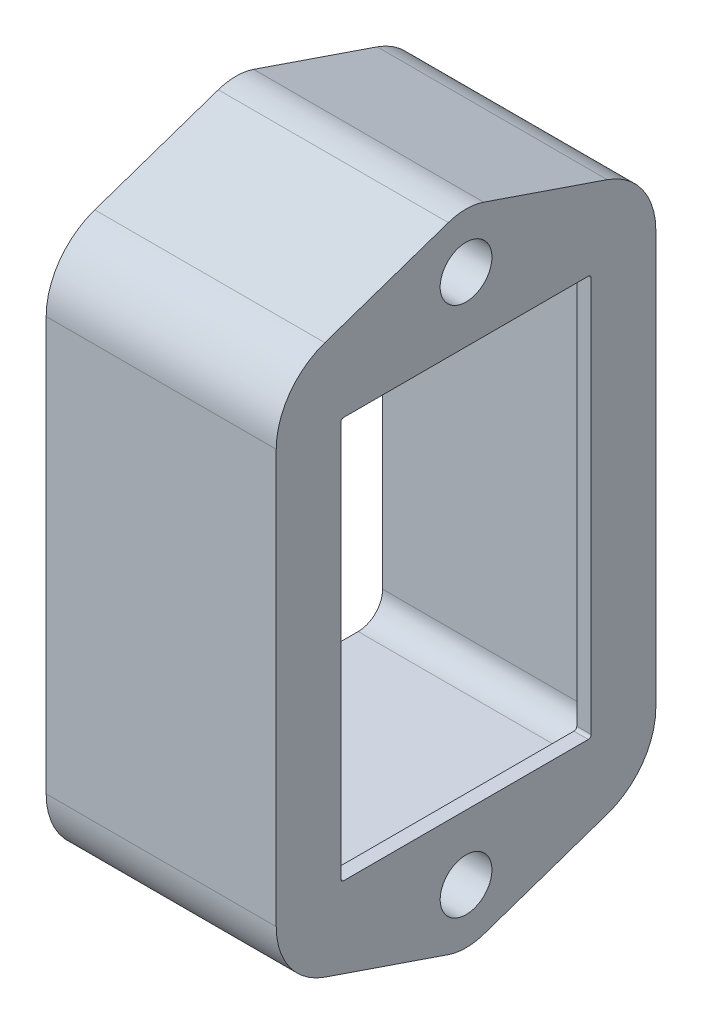
ISO-10303-21;
HEADER;
FILE_DESCRIPTION(('STEP AP214'),'2;1');
FILE_NAME('part.step','',(''),(''),'','','');
FILE_SCHEMA(('AUTOMOTIVE_DESIGN { 1 0 10303 214 1 1 1 1 }'));
ENDSEC;
DATA;
#1=APPLICATION_CONTEXT('core data for automotive mechanical design processes');
#2=APPLICATION_PROTOCOL_DEFINITION('international standard','automotive_design',2000,#1);
#3=PRODUCT_CONTEXT('',#1,'mechanical');
#4=PRODUCT('Part','Part','',(#3));
#5=PRODUCT_RELATED_PRODUCT_CATEGORY('part','',(#4));
#6=PRODUCT_DEFINITION_FORMATION('','',#4);
#7=PRODUCT_DEFINITION_CONTEXT('part definition',#1,'design');
#8=PRODUCT_DEFINITION('design','',#6,#7);
#9=PRODUCT_DEFINITION_SHAPE('','',#8);
#10=(LENGTH_UNIT() NAMED_UNIT(*) SI_UNIT(.MILLI.,.METRE.));
#11=(NAMED_UNIT(*) PLANE_ANGLE_UNIT() SI_UNIT($,.RADIAN.));
#12=(NAMED_UNIT(*) SI_UNIT($,.STERADIAN.) SOLID_ANGLE_UNIT());
#13=UNCERTAINTY_MEASURE_WITH_UNIT(LENGTH_MEASURE(1.E-05),#10,'distance_accuracy_value','');
#14=(GEOMETRIC_REPRESENTATION_CONTEXT(3) GLOBAL_UNCERTAINTY_ASSIGNED_CONTEXT((#13)) GLOBAL_UNIT_ASSIGNED_CONTEXT((#10,
#11,#12)) REPRESENTATION_CONTEXT('',''));
#15=CARTESIAN_POINT('',(0.,0.,0.));
#16=DIRECTION('',(0.,0.,1.));
#17=DIRECTION('',(1.,0.,0.));
#18=AXIS2_PLACEMENT_3D('',#15,#16,#17);
#19=CARTESIAN_POINT('',(2.,-40.2126231948041,-17.0000000000001));
#20=DIRECTION('',(-1.,0.,0.));
#21=DIRECTION('',(0.,0.,1.));
#22=AXIS2_PLACEMENT_3D('',#19,#20,#21);
#23=CYLINDRICAL_SURFACE('',#22,3.4);
#24=DIRECTION('',(-1.,0.,0.));
#25=VECTOR('',#24,1.);
#26=CARTESIAN_POINT('',(2.,-43.6126231948041,-17.0000000000001));
#27=LINE('',#26,#25);
#28=CARTESIAN_POINT('',(0.,-43.6126231948041,-17.0000000000001));
#29=VERTEX_POINT('',#28);
#30=CARTESIAN_POINT('',(-30.,-43.6126231948041,-17.0000000000001));
#31=VERTEX_POINT('',#30);
#32=EDGE_CURVE('E454',#29,#31,#27,.T.);
#33=ORIENTED_EDGE('',*,*,#32,.F.);
#34=CARTESIAN_POINT('',(0.,-40.2126231948041,-17.0000000000001));
#35=DIRECTION('',(1.,0.,0.));
#36=DIRECTION('',(0.,0.,-1.));
#37=AXIS2_PLACEMENT_3D('',#34,#35,#36);
#38=CIRCLE('',#37,3.4);
#39=CARTESIAN_POINT('',(0.,-40.2126231948041,-20.4000000000001));
#40=VERTEX_POINT('',#39);
#41=EDGE_CURVE('E61',#29,#40,#38,.T.);
#42=ORIENTED_EDGE('',*,*,#41,.T.);
#43=DIRECTION('',(-1.,0.,0.));
#44=VECTOR('',#43,1.);
#45=CARTESIAN_POINT('',(2.,-40.2126231948041,-20.4000000000001));
#46=LINE('',#45,#44);
#47=CARTESIAN_POINT('',(-30.,-40.2126231948041,-20.4000000000001));
#48=VERTEX_POINT('',#47);
#49=EDGE_CURVE('E475',#40,#48,#46,.T.);
#50=ORIENTED_EDGE('',*,*,#49,.T.);
#51=CARTESIAN_POINT('',(-30.,-40.2126231948041,-17.0000000000001));
#52=DIRECTION('',(1.,0.,0.));
#53=DIRECTION('',(0.,0.,-1.));
#54=AXIS2_PLACEMENT_3D('',#51,#52,#53);
#55=CIRCLE('',#54,3.4);
#56=EDGE_CURVE('E366',#31,#48,#55,.T.);
#57=ORIENTED_EDGE('',*,*,#56,.F.);
#58=EDGE_LOOP('',(#33,#42,#50,#57));
#59=FACE_BOUND('',#58,.T.);
#60=ADVANCED_FACE('F45',(#59),#23,.F.);
#61=CARTESIAN_POINT('',(2.,-40.2126231948041,-20.4000000000001));
#62=DIRECTION('',(0.,0.,1.));
#63=DIRECTION('',(1.,0.,0.));
#64=AXIS2_PLACEMENT_3D('',#61,#62,#63);
#65=PLANE('',#64);
#66=ORIENTED_EDGE('',*,*,#49,.F.);
#67=DIRECTION('',(0.,1.,0.));
#68=VECTOR('',#67,1.);
#69=CARTESIAN_POINT('',(0.,-40.2126231948041,-20.4000000000001));
#70=LINE('',#69,#68);
#71=CARTESIAN_POINT('',(0.,14.7873768051959,-20.4000000000001));
#72=VERTEX_POINT('',#71);
#73=EDGE_CURVE('E338',#40,#72,#70,.T.);
#74=ORIENTED_EDGE('',*,*,#73,.T.);
#75=DIRECTION('',(-1.,0.,0.));
#76=VECTOR('',#75,1.);
#77=CARTESIAN_POINT('',(2.,14.7873768051959,-20.4000000000001));
#78=LINE('',#77,#76);
#79=CARTESIAN_POINT('',(-30.,14.7873768051959,-20.4000000000001));
#80=VERTEX_POINT('',#79);
#81=EDGE_CURVE('E472',#72,#80,#78,.T.);
#82=ORIENTED_EDGE('',*,*,#81,.T.);
#83=DIRECTION('',(0.,1.,0.));
#84=VECTOR('',#83,1.);
#85=CARTESIAN_POINT('',(-30.,-40.2126231948041,-20.4000000000001));
#86=LINE('',#85,#84);
#87=EDGE_CURVE('E370',#48,#80,#86,.T.);
#88=ORIENTED_EDGE('',*,*,#87,.F.);
#89=EDGE_LOOP('',(#66,#74,#82,#88));
#90=FACE_BOUND('',#89,.T.);
#91=ADVANCED_FACE('F641',(#90),#65,.T.);
#92=CARTESIAN_POINT('',(2.,14.7873768051959,-17.0000000000001));
#93=DIRECTION('',(-1.,0.,0.));
#94=DIRECTION('',(0.,0.,1.));
#95=AXIS2_PLACEMENT_3D('',#92,#93,#94);
#96=CYLINDRICAL_SURFACE('',#95,3.4);
#97=ORIENTED_EDGE('',*,*,#81,.F.);
#98=CARTESIAN_POINT('',(0.,14.7873768051959,-17.0000000000001));
#99=DIRECTION('',(1.,0.,0.));
#100=DIRECTION('',(0.,0.,-1.));
#101=AXIS2_PLACEMENT_3D('',#98,#99,#100);
#102=CIRCLE('',#101,3.40000000000001);
#103=CARTESIAN_POINT('',(0.,18.1873768051959,-17.0000000000001));
#104=VERTEX_POINT('',#103);
#105=EDGE_CURVE('E342',#72,#104,#102,.T.);
#106=ORIENTED_EDGE('',*,*,#105,.T.);
#107=DIRECTION('',(-1.,0.,0.));
#108=VECTOR('',#107,1.);
#109=CARTESIAN_POINT('',(2.,18.1873768051959,-17.0000000000001));
#110=LINE('',#109,#108);
#111=CARTESIAN_POINT('',(-30.,18.1873768051959,-17.0000000000001));
#112=VERTEX_POINT('',#111);
#113=EDGE_CURVE('E469',#104,#112,#110,.T.);
#114=ORIENTED_EDGE('',*,*,#113,.T.);
#115=CARTESIAN_POINT('',(-30.,14.7873768051959,-17.0000000000001));
#116=DIRECTION('',(1.,0.,0.));
#117=DIRECTION('',(0.,0.,-1.));
#118=AXIS2_PLACEMENT_3D('',#115,#116,#117);
#119=CIRCLE('',#118,3.4);
#120=EDGE_CURVE('E374',#80,#112,#119,.T.);
#121=ORIENTED_EDGE('',*,*,#120,.F.);
#122=EDGE_LOOP('',(#97,#106,#114,#121));
#123=FACE_BOUND('',#122,.T.);
#124=ADVANCED_FACE('F648',(#123),#96,.F.);
#125=CARTESIAN_POINT('',(2.,18.1873768051959,0.));
#126=DIRECTION('',(0.,-1.,0.));
#127=DIRECTION('',(0.,0.,-1.));
#128=AXIS2_PLACEMENT_3D('',#125,#126,#127);
#129=PLANE('',#128);
#130=ORIENTED_EDGE('',*,*,#113,.F.);
#131=DIRECTION('',(0.,0.,1.));
#132=VECTOR('',#131,1.);
#133=CARTESIAN_POINT('',(0.,18.1873768051959,-17.0000000000001));
#134=LINE('',#133,#132);
#135=CARTESIAN_POINT('',(0.,18.1873768051959,17.0000000000001));
#136=VERTEX_POINT('',#135);
#137=EDGE_CURVE('E346',#104,#136,#134,.T.);
#138=ORIENTED_EDGE('',*,*,#137,.T.);
#139=DIRECTION('',(-1.,0.,0.));
#140=VECTOR('',#139,1.);
#141=CARTESIAN_POINT('',(2.,18.1873768051959,17.0000000000001));
#142=LINE('',#141,#140);
#143=CARTESIAN_POINT('',(-30.,18.1873768051959,17.0000000000001));
#144=VERTEX_POINT('',#143);
#145=EDGE_CURVE('E466',#136,#144,#142,.T.);
#146=ORIENTED_EDGE('',*,*,#145,.T.);
#147=DIRECTION('',(0.,0.,1.));
#148=VECTOR('',#147,1.);
#149=CARTESIAN_POINT('',(-30.,18.1873768051959,-17.0000000000001));
#150=LINE('',#149,#148);
#151=EDGE_CURVE('E378',#112,#144,#150,.T.);
#152=ORIENTED_EDGE('',*,*,#151,.F.);
#153=EDGE_LOOP('',(#130,#138,#146,#152));
#154=FACE_BOUND('',#153,.T.);
#155=ADVANCED_FACE('F816',(#154),#129,.T.);
#156=CARTESIAN_POINT('',(2.,14.7873768051959,17.0000000000001));
#157=DIRECTION('',(-1.,0.,0.));
#158=DIRECTION('',(0.,0.,1.));
#159=AXIS2_PLACEMENT_3D('',#156,#157,#158);
#160=CYLINDRICAL_SURFACE('',#159,3.4);
#161=ORIENTED_EDGE('',*,*,#145,.F.);
#162=CARTESIAN_POINT('',(0.,14.7873768051959,17.0000000000001));
#163=DIRECTION('',(1.,0.,0.));
#164=DIRECTION('',(0.,0.,-1.));
#165=AXIS2_PLACEMENT_3D('',#162,#163,#164);
#166=CIRCLE('',#165,3.4);
#167=CARTESIAN_POINT('',(0.,14.7873768051959,20.4000000000001));
#168=VERTEX_POINT('',#167);
#169=EDGE_CURVE('E350',#136,#168,#166,.T.);
#170=ORIENTED_EDGE('',*,*,#169,.T.);
#171=DIRECTION('',(-1.,0.,0.));
#172=VECTOR('',#171,1.);
#173=CARTESIAN_POINT('',(2.,14.7873768051959,20.4000000000001));
#174=LINE('',#173,#172);
#175=CARTESIAN_POINT('',(-30.,14.7873768051959,20.4000000000001));
#176=VERTEX_POINT('',#175);
#177=EDGE_CURVE('E463',#168,#176,#174,.T.);
#178=ORIENTED_EDGE('',*,*,#177,.T.);
#179=CARTESIAN_POINT('',(-30.,14.7873768051959,17.0000000000001));
#180=DIRECTION('',(1.,0.,0.));
#181=DIRECTION('',(0.,0.,-1.));
#182=AXIS2_PLACEMENT_3D('',#179,#180,#181);
#183=CIRCLE('',#182,3.4);
#184=EDGE_CURVE('E382',#144,#176,#183,.T.);
#185=ORIENTED_EDGE('',*,*,#184,.F.);
#186=EDGE_LOOP('',(#161,#170,#178,#185));
#187=FACE_BOUND('',#186,.T.);
#188=ADVANCED_FACE('F807',(#187),#160,.F.);
#189=CARTESIAN_POINT('',(2.,14.7873768051959,20.4000000000001));
#190=DIRECTION('',(0.,0.,-1.));
#191=DIRECTION('',(-1.,0.,0.));
#192=AXIS2_PLACEMENT_3D('',#189,#190,#191);
#193=PLANE('',#192);
#194=ORIENTED_EDGE('',*,*,#177,.F.);
#195=DIRECTION('',(0.,-1.,0.));
#196=VECTOR('',#195,1.);
#197=CARTESIAN_POINT('',(0.,14.7873768051959,20.4000000000001));
#198=LINE('',#197,#196);
#199=CARTESIAN_POINT('',(0.,-40.2126231948041,20.4000000000001));
#200=VERTEX_POINT('',#199);
#201=EDGE_CURVE('E354',#168,#200,#198,.T.);
#202=ORIENTED_EDGE('',*,*,#201,.T.);
#203=DIRECTION('',(-1.,0.,0.));
#204=VECTOR('',#203,1.);
#205=CARTESIAN_POINT('',(2.,-40.2126231948041,20.4000000000001));
#206=LINE('',#205,#204);
#207=CARTESIAN_POINT('',(-30.,-40.2126231948041,20.4000000000001));
#208=VERTEX_POINT('',#207);
#209=EDGE_CURVE('E460',#200,#208,#206,.T.);
#210=ORIENTED_EDGE('',*,*,#209,.T.);
#211=DIRECTION('',(0.,-1.,0.));
#212=VECTOR('',#211,1.);
#213=CARTESIAN_POINT('',(-30.,14.7873768051959,20.4000000000001));
#214=LINE('',#213,#212);
#215=EDGE_CURVE('E386',#176,#208,#214,.T.);
#216=ORIENTED_EDGE('',*,*,#215,.F.);
#217=EDGE_LOOP('',(#194,#202,#210,#216));
#218=FACE_BOUND('',#217,.T.);
#219=ADVANCED_FACE('F798',(#218),#193,.T.);
#220=CARTESIAN_POINT('',(2.,-40.2126231948041,17.0000000000001));
#221=DIRECTION('',(-1.,0.,0.));
#222=DIRECTION('',(0.,0.,1.));
#223=AXIS2_PLACEMENT_3D('',#220,#221,#222);
#224=CYLINDRICAL_SURFACE('',#223,3.4);
#225=ORIENTED_EDGE('',*,*,#209,.F.);
#226=CARTESIAN_POINT('',(0.,-40.2126231948041,17.0000000000001));
#227=DIRECTION('',(1.,0.,0.));
#228=DIRECTION('',(0.,0.,-1.));
#229=AXIS2_PLACEMENT_3D('',#226,#227,#228);
#230=CIRCLE('',#229,3.4);
#231=CARTESIAN_POINT('',(0.,-43.6126231948041,17.0000000000001));
#232=VERTEX_POINT('',#231);
#233=EDGE_CURVE('E312',#200,#232,#230,.T.);
#234=ORIENTED_EDGE('',*,*,#233,.T.);
#235=DIRECTION('',(-1.,0.,0.));
#236=VECTOR('',#235,1.);
#237=CARTESIAN_POINT('',(2.,-43.6126231948041,17.0000000000001));
#238=LINE('',#237,#236);
#239=CARTESIAN_POINT('',(-30.,-43.6126231948041,17.0000000000001));
#240=VERTEX_POINT('',#239);
#241=EDGE_CURVE('E457',#232,#240,#238,.T.);
#242=ORIENTED_EDGE('',*,*,#241,.T.);
#243=CARTESIAN_POINT('',(-30.,-40.2126231948041,17.0000000000001));
#244=DIRECTION('',(1.,0.,0.));
#245=DIRECTION('',(0.,0.,-1.));
#246=AXIS2_PLACEMENT_3D('',#243,#244,#245);
#247=CIRCLE('',#246,3.4);
#248=EDGE_CURVE('E390',#208,#240,#247,.T.);
#249=ORIENTED_EDGE('',*,*,#248,.F.);
#250=EDGE_LOOP('',(#225,#234,#242,#249));
#251=FACE_BOUND('',#250,.T.);
#252=ADVANCED_FACE('F786',(#251),#224,.F.);
#253=CARTESIAN_POINT('',(2.,-43.6126231948041,0.));
#254=DIRECTION('',(0.,1.,0.));
#255=DIRECTION('',(0.,0.,1.));
#256=AXIS2_PLACEMENT_3D('',#253,#254,#255);
#257=PLANE('',#256);
#258=ORIENTED_EDGE('',*,*,#241,.F.);
#259=DIRECTION('',(0.,0.,-1.));
#260=VECTOR('',#259,1.);
#261=CARTESIAN_POINT('',(0.,-43.6126231948041,17.0000000000001));
#262=LINE('',#261,#260);
#263=EDGE_CURVE('E333',#232,#29,#262,.T.);
#264=ORIENTED_EDGE('',*,*,#263,.T.);
#265=ORIENTED_EDGE('',*,*,#32,.T.);
#266=DIRECTION('',(0.,0.,-1.));
#267=VECTOR('',#266,1.);
#268=CARTESIAN_POINT('',(-30.,-43.6126231948041,17.0000000000001));
#269=LINE('',#268,#267);
#270=EDGE_CURVE('E394',#240,#31,#269,.T.);
#271=ORIENTED_EDGE('',*,*,#270,.F.);
#272=EDGE_LOOP('',(#258,#264,#265,#271));
#273=FACE_BOUND('',#272,.T.);
#274=ADVANCED_FACE('F604',(#273),#257,.T.);
#275=CARTESIAN_POINT('',(2.,16.0396786229446,-16.4000000000001));
#276=DIRECTION('',(-1.,0.,0.));
#277=DIRECTION('',(0.,0.,1.));
#278=AXIS2_PLACEMENT_3D('',#275,#276,#277);
#279=PLANE('',#278);
#280=CARTESIAN_POINT('',(2.,16.0396786229446,-16.4000000000001));
#281=DIRECTION('',(1.,0.,0.));
#282=DIRECTION('',(0.,0.,1.));
#283=AXIS2_PLACEMENT_3D('',#280,#281,#282);
#284=CIRCLE('',#283,10.);
#285=CARTESIAN_POINT('',(2.,16.0396786229446,-26.4000000000001));
#286=VERTEX_POINT('',#285);
#287=CARTESIAN_POINT('',(2.,25.501214940769,-19.6371794059783));
#288=VERTEX_POINT('',#287);
#289=EDGE_CURVE('E478',#286,#288,#284,.T.);
#290=ORIENTED_EDGE('',*,*,#289,.T.);
#291=DIRECTION('',(0.,0.323717940597819,0.946153631782443));
#292=VECTOR('',#291,1.);
#293=CARTESIAN_POINT('',(2.,25.501214940769,-19.6371794059783));
#294=LINE('',#293,#292);
#295=CARTESIAN_POINT('',(2.,31.3781444067425,-2.46025634854342));
#296=VERTEX_POINT('',#295);
#297=EDGE_CURVE('E481',#288,#296,#294,.T.);
#298=ORIENTED_EDGE('',*,*,#297,.T.);
#299=CARTESIAN_POINT('',(2.,24.1873768051959,0.));
#300=DIRECTION('',(1.,0.,0.));
#301=DIRECTION('',(0.,0.,-1.));
#302=AXIS2_PLACEMENT_3D('',#299,#300,#301);
#303=CIRCLE('',#302,7.6);
#304=CARTESIAN_POINT('',(2.,31.3781444067425,2.46025634854342));
#305=VERTEX_POINT('',#304);
#306=EDGE_CURVE('E484',#296,#305,#303,.T.);
#307=ORIENTED_EDGE('',*,*,#306,.T.);
#308=DIRECTION('',(0.,-0.323717940597819,0.946153631782443));
#309=VECTOR('',#308,1.);
#310=CARTESIAN_POINT('',(2.,25.501214940769,19.6371794059783));
#311=LINE('',#310,#309);
#312=CARTESIAN_POINT('',(2.,25.501214940769,19.6371794059783));
#313=VERTEX_POINT('',#312);
#314=EDGE_CURVE('E487',#305,#313,#311,.T.);
#315=ORIENTED_EDGE('',*,*,#314,.T.);
#316=CARTESIAN_POINT('',(2.,16.0396786229446,16.4000000000001));
#317=DIRECTION('',(1.,0.,0.));
#318=DIRECTION('',(0.,0.,-1.));
#319=AXIS2_PLACEMENT_3D('',#316,#317,#318);
#320=CIRCLE('',#319,10.);
#321=CARTESIAN_POINT('',(2.,16.0396786229446,26.4000000000001));
#322=VERTEX_POINT('',#321);
#323=EDGE_CURVE('E490',#313,#322,#320,.T.);
#324=ORIENTED_EDGE('',*,*,#323,.T.);
#325=DIRECTION('',(0.,-1.,0.));
#326=VECTOR('',#325,1.);
#327=CARTESIAN_POINT('',(2.,-41.4649250125528,26.4000000000001));
#328=LINE('',#327,#326);
#329=CARTESIAN_POINT('',(2.,-41.4649250125528,26.4000000000001));
#330=VERTEX_POINT('',#329);
#331=EDGE_CURVE('E493',#322,#330,#328,.T.);
#332=ORIENTED_EDGE('',*,*,#331,.T.);
#333=CARTESIAN_POINT('',(2.,-41.4649250125528,16.4000000000001));
#334=DIRECTION('',(1.,0.,0.));
#335=DIRECTION('',(0.,0.,1.));
#336=AXIS2_PLACEMENT_3D('',#333,#334,#335);
#337=CIRCLE('',#336,9.99999999999999);
#338=CARTESIAN_POINT('',(2.,-50.9264613303773,19.6371794059783));
#339=VERTEX_POINT('',#338);
#340=EDGE_CURVE('E496',#330,#339,#337,.T.);
#341=ORIENTED_EDGE('',*,*,#340,.T.);
#342=DIRECTION('',(0.,-0.323717940597819,-0.946153631782443));
#343=VECTOR('',#342,1.);
#344=CARTESIAN_POINT('',(2.,-50.9264613303773,19.6371794059783));
#345=LINE('',#344,#343);
#346=CARTESIAN_POINT('',(2.,-56.8033907963507,2.46025634854342));
#347=VERTEX_POINT('',#346);
#348=EDGE_CURVE('E499',#339,#347,#345,.T.);
#349=ORIENTED_EDGE('',*,*,#348,.T.);
#350=CARTESIAN_POINT('',(2.,-49.6126231948041,0.));
#351=DIRECTION('',(1.,0.,0.));
#352=DIRECTION('',(0.,0.,1.));
#353=AXIS2_PLACEMENT_3D('',#350,#351,#352);
#354=CIRCLE('',#353,7.60000000000003);
#355=CARTESIAN_POINT('',(2.,-56.8033907963507,-2.46025634854342));
#356=VERTEX_POINT('',#355);
#357=EDGE_CURVE('E502',#347,#356,#354,.T.);
#358=ORIENTED_EDGE('',*,*,#357,.T.);
#359=DIRECTION('',(0.,0.323717940597819,-0.946153631782443));
#360=VECTOR('',#359,1.);
#361=CARTESIAN_POINT('',(2.,-50.9264613303773,-19.6371794059783));
#362=LINE('',#361,#360);
#363=CARTESIAN_POINT('',(2.,-50.9264613303773,-19.6371794059783));
#364=VERTEX_POINT('',#363);
#365=EDGE_CURVE('E505',#356,#364,#362,.T.);
#366=ORIENTED_EDGE('',*,*,#365,.T.);
#367=CARTESIAN_POINT('',(2.,-41.4649250125528,-16.4000000000001));
#368=DIRECTION('',(1.,0.,0.));
#369=DIRECTION('',(0.,0.,-1.));
#370=AXIS2_PLACEMENT_3D('',#367,#368,#369);
#371=CIRCLE('',#370,9.99999999999999);
#372=CARTESIAN_POINT('',(2.,-41.4649250125528,-26.4000000000001));
#373=VERTEX_POINT('',#372);
#374=EDGE_CURVE('E508',#364,#373,#371,.T.);
#375=ORIENTED_EDGE('',*,*,#374,.T.);
#376=DIRECTION('',(0.,1.,0.));
#377=VECTOR('',#376,1.);
#378=CARTESIAN_POINT('',(2.,-41.4649250125528,-26.4000000000001));
#379=LINE('',#378,#377);
#380=EDGE_CURVE('E69',#373,#286,#379,.T.);
#381=ORIENTED_EDGE('',*,*,#380,.T.);
#382=EDGE_LOOP('',(#290,#298,#307,#315,#324,#332,#341,#349,#358,#366,#375,#381));
#383=FACE_BOUND('',#382,.T.);
#384=CARTESIAN_POINT('',(2.,24.1873768051959,0.));
#385=DIRECTION('',(1.,0.,0.));
#386=DIRECTION('',(0.,0.,-1.));
#387=AXIS2_PLACEMENT_3D('',#384,#385,#386);
#388=CIRCLE('',#387,3.6);
#389=CARTESIAN_POINT('',(2.,24.1873768051959,-3.6));
#390=VERTEX_POINT('',#389);
#391=EDGE_CURVE('E450',#390,#390,#388,.T.);
#392=ORIENTED_EDGE('',*,*,#391,.F.);
#393=EDGE_LOOP('',(#392));
#394=FACE_BOUND('',#393,.T.);
#395=CARTESIAN_POINT('',(2.,-49.6126231948041,0.));
#396=DIRECTION('',(1.,0.,0.));
#397=DIRECTION('',(0.,0.,1.));
#398=AXIS2_PLACEMENT_3D('',#395,#396,#397);
#399=CIRCLE('',#398,3.6);
#400=CARTESIAN_POINT('',(2.,-49.6126231948041,3.6));
#401=VERTEX_POINT('',#400);
#402=EDGE_CURVE('E446',#401,#401,#399,.T.);
#403=ORIENTED_EDGE('',*,*,#402,.F.);
#404=EDGE_LOOP('',(#403));
#405=FACE_BOUND('',#404,.T.);
#406=CARTESIAN_POINT('',(2.,-40.2126231948041,17.0000000000001));
#407=DIRECTION('',(1.,0.,0.));
#408=DIRECTION('',(0.,0.,-1.));
#409=AXIS2_PLACEMENT_3D('',#406,#407,#408);
#410=CIRCLE('',#409,0.400000000000003);
#411=CARTESIAN_POINT('',(2.,-40.2126231948041,17.4000000000001));
#412=VERTEX_POINT('',#411);
#413=CARTESIAN_POINT('',(2.,-40.6126231948041,17.0000000000001));
#414=VERTEX_POINT('',#413);
#415=EDGE_CURVE('E238',#412,#414,#410,.T.);
#416=ORIENTED_EDGE('',*,*,#415,.F.);
#417=DIRECTION('',(0.,-1.,0.));
#418=VECTOR('',#417,1.);
#419=CARTESIAN_POINT('',(2.,14.7873768051959,17.4000000000001));
#420=LINE('',#419,#418);
#421=CARTESIAN_POINT('',(2.,14.7873768051959,17.4000000000001));
#422=VERTEX_POINT('',#421);
#423=EDGE_CURVE('E259',#422,#412,#420,.T.);
#424=ORIENTED_EDGE('',*,*,#423,.F.);
#425=CARTESIAN_POINT('',(2.,14.7873768051959,17.0000000000001));
#426=DIRECTION('',(1.,0.,0.));
#427=DIRECTION('',(0.,0.,-1.));
#428=AXIS2_PLACEMENT_3D('',#425,#426,#427);
#429=CIRCLE('',#428,0.400000000000005);
#430=CARTESIAN_POINT('',(2.,15.1873768051959,17.0000000000001));
#431=VERTEX_POINT('',#430);
#432=EDGE_CURVE('E263',#431,#422,#429,.T.);
#433=ORIENTED_EDGE('',*,*,#432,.F.);
#434=DIRECTION('',(0.,0.,1.));
#435=VECTOR('',#434,1.);
#436=CARTESIAN_POINT('',(2.,15.1873768051959,-17.0000000000001));
#437=LINE('',#436,#435);
#438=CARTESIAN_POINT('',(2.,15.1873768051959,-17.0000000000001));
#439=VERTEX_POINT('',#438);
#440=EDGE_CURVE('E302',#439,#431,#437,.T.);
#441=ORIENTED_EDGE('',*,*,#440,.F.);
#442=CARTESIAN_POINT('',(2.,14.7873768051959,-17.0000000000001));
#443=DIRECTION('',(1.,0.,0.));
#444=DIRECTION('',(0.,0.,-1.));
#445=AXIS2_PLACEMENT_3D('',#442,#443,#444);
#446=CIRCLE('',#445,0.400000000000006);
#447=CARTESIAN_POINT('',(2.,14.7873768051959,-17.4000000000001));
#448=VERTEX_POINT('',#447);
#449=EDGE_CURVE('E298',#448,#439,#446,.T.);
#450=ORIENTED_EDGE('',*,*,#449,.F.);
#451=DIRECTION('',(0.,1.,0.));
#452=VECTOR('',#451,1.);
#453=CARTESIAN_POINT('',(2.,-40.2126231948041,-17.4000000000001));
#454=LINE('',#453,#452);
#455=CARTESIAN_POINT('',(2.,-40.2126231948041,-17.4000000000001));
#456=VERTEX_POINT('',#455);
#457=EDGE_CURVE('E294',#456,#448,#454,.T.);
#458=ORIENTED_EDGE('',*,*,#457,.F.);
#459=CARTESIAN_POINT('',(2.,-40.2126231948041,-17.0000000000001));
#460=DIRECTION('',(1.,0.,0.));
#461=DIRECTION('',(0.,0.,-1.));
#462=AXIS2_PLACEMENT_3D('',#459,#460,#461);
#463=CIRCLE('',#462,0.400000000000005);
#464=CARTESIAN_POINT('',(2.,-40.6126231948041,-17.0000000000001));
#465=VERTEX_POINT('',#464);
#466=EDGE_CURVE('E290',#465,#456,#463,.T.);
#467=ORIENTED_EDGE('',*,*,#466,.F.);
#468=DIRECTION('',(0.,0.,-1.));
#469=VECTOR('',#468,1.);
#470=CARTESIAN_POINT('',(2.,-40.6126231948041,17.0000000000001));
#471=LINE('',#470,#469);
#472=EDGE_CURVE('E287',#414,#465,#471,.T.);
#473=ORIENTED_EDGE('',*,*,#472,.F.);
#474=EDGE_LOOP('',(#416,#424,#433,#441,#450,#458,#467,#473));
#475=FACE_BOUND('',#474,.T.);
#476=ADVANCED_FACE('F601',(#383,#394,#405,#475),#279,.F.);
#477=CARTESIAN_POINT('',(2.,16.0396786229446,-16.4000000000001));
#478=DIRECTION('',(-1.,0.,0.));
#479=DIRECTION('',(0.,0.,1.));
#480=AXIS2_PLACEMENT_3D('',#477,#478,#479);
#481=CYLINDRICAL_SURFACE('',#480,10.);
#482=DIRECTION('',(-1.,0.,0.));
#483=VECTOR('',#482,1.);
#484=CARTESIAN_POINT('',(2.,16.0396786229446,-26.4000000000001));
#485=LINE('',#484,#483);
#486=CARTESIAN_POINT('',(-30.,16.0396786229446,-26.4000000000001));
#487=VERTEX_POINT('',#486);
#488=EDGE_CURVE('E513',#286,#487,#485,.T.);
#489=ORIENTED_EDGE('',*,*,#488,.T.);
#490=CARTESIAN_POINT('',(-30.,16.0396786229446,-16.4000000000001));
#491=DIRECTION('',(1.,0.,0.));
#492=DIRECTION('',(0.,0.,1.));
#493=AXIS2_PLACEMENT_3D('',#490,#491,#492);
#494=CIRCLE('',#493,10.);
#495=CARTESIAN_POINT('',(-30.,25.501214940769,-19.6371794059783));
#496=VERTEX_POINT('',#495);
#497=EDGE_CURVE('E398',#487,#496,#494,.T.);
#498=ORIENTED_EDGE('',*,*,#497,.T.);
#499=DIRECTION('',(-1.,0.,0.));
#500=VECTOR('',#499,1.);
#501=CARTESIAN_POINT('',(2.,25.501214940769,-19.6371794059783));
#502=LINE('',#501,#500);
#503=EDGE_CURVE('E11',#288,#496,#502,.T.);
#504=ORIENTED_EDGE('',*,*,#503,.F.);
#505=ORIENTED_EDGE('',*,*,#289,.F.);
#506=EDGE_LOOP('',(#489,#498,#504,#505));
#507=FACE_BOUND('',#506,.T.);
#508=ADVANCED_FACE('F47',(#507),#481,.T.);
#509=CARTESIAN_POINT('',(2.,25.501214940769,-19.6371794059783));
#510=DIRECTION('',(0.,-0.946153631782443,0.323717940597819));
#511=DIRECTION('',(0.,-0.323717940597819,-0.946153631782443));
#512=AXIS2_PLACEMENT_3D('',#509,#510,#511);
#513=PLANE('',#512);
#514=ORIENTED_EDGE('',*,*,#503,.T.);
#515=DIRECTION('',(0.,0.323717940597819,0.946153631782443));
#516=VECTOR('',#515,1.);
#517=CARTESIAN_POINT('',(-30.,25.501214940769,-19.6371794059783));
#518=LINE('',#517,#516);
#519=CARTESIAN_POINT('',(-30.,31.3781444067425,-2.46025634854342));
#520=VERTEX_POINT('',#519);
#521=EDGE_CURVE('E402',#496,#520,#518,.T.);
#522=ORIENTED_EDGE('',*,*,#521,.T.);
#523=DIRECTION('',(-1.,0.,0.));
#524=VECTOR('',#523,1.);
#525=CARTESIAN_POINT('',(2.,31.3781444067425,-2.46025634854342));
#526=LINE('',#525,#524);
#527=EDGE_CURVE('E54',#296,#520,#526,.T.);
#528=ORIENTED_EDGE('',*,*,#527,.F.);
#529=ORIENTED_EDGE('',*,*,#297,.F.);
#530=EDGE_LOOP('',(#514,#522,#528,#529));
#531=FACE_BOUND('',#530,.T.);
#532=ADVANCED_FACE('F556',(#531),#513,.F.);
#533=CARTESIAN_POINT('',(2.,24.1873768051959,0.));
#534=DIRECTION('',(-1.,0.,0.));
#535=DIRECTION('',(0.,0.,1.));
#536=AXIS2_PLACEMENT_3D('',#533,#534,#535);
#537=CYLINDRICAL_SURFACE('',#536,7.6);
#538=ORIENTED_EDGE('',*,*,#527,.T.);
#539=CARTESIAN_POINT('',(-30.,24.1873768051959,0.));
#540=DIRECTION('',(1.,0.,0.));
#541=DIRECTION('',(0.,0.,-1.));
#542=AXIS2_PLACEMENT_3D('',#539,#540,#541);
#543=CIRCLE('',#542,7.6);
#544=CARTESIAN_POINT('',(-30.,31.3781444067425,2.46025634854342));
#545=VERTEX_POINT('',#544);
#546=EDGE_CURVE('E406',#520,#545,#543,.T.);
#547=ORIENTED_EDGE('',*,*,#546,.T.);
#548=DIRECTION('',(-1.,0.,0.));
#549=VECTOR('',#548,1.);
#550=CARTESIAN_POINT('',(2.,31.3781444067425,2.46025634854342));
#551=LINE('',#550,#549);
#552=EDGE_CURVE('E540',#305,#545,#551,.T.);
#553=ORIENTED_EDGE('',*,*,#552,.F.);
#554=ORIENTED_EDGE('',*,*,#306,.F.);
#555=EDGE_LOOP('',(#538,#547,#553,#554));
#556=FACE_BOUND('',#555,.T.);
#557=ADVANCED_FACE('F547',(#556),#537,.T.);
#558=CARTESIAN_POINT('',(2.,25.501214940769,19.6371794059783));
#559=DIRECTION('',(0.,-0.946153631782443,-0.323717940597819));
#560=DIRECTION('',(0.,0.323717940597819,-0.946153631782443));
#561=AXIS2_PLACEMENT_3D('',#558,#559,#560);
#562=PLANE('',#561);
#563=ORIENTED_EDGE('',*,*,#552,.T.);
#564=DIRECTION('',(0.,-0.323717940597819,0.946153631782443));
#565=VECTOR('',#564,1.);
#566=CARTESIAN_POINT('',(-30.,25.501214940769,19.6371794059783));
#567=LINE('',#566,#565);
#568=CARTESIAN_POINT('',(-30.,25.501214940769,19.6371794059783));
#569=VERTEX_POINT('',#568);
#570=EDGE_CURVE('E410',#545,#569,#567,.T.);
#571=ORIENTED_EDGE('',*,*,#570,.T.);
#572=DIRECTION('',(-1.,0.,0.));
#573=VECTOR('',#572,1.);
#574=CARTESIAN_POINT('',(2.,25.501214940769,19.6371794059783));
#575=LINE('',#574,#573);
#576=EDGE_CURVE('E537',#313,#569,#575,.T.);
#577=ORIENTED_EDGE('',*,*,#576,.F.);
#578=ORIENTED_EDGE('',*,*,#314,.F.);
#579=EDGE_LOOP('',(#563,#571,#577,#578));
#580=FACE_BOUND('',#579,.T.);
#581=ADVANCED_FACE('F599',(#580),#562,.F.);
#582=CARTESIAN_POINT('',(2.,16.0396786229446,16.4000000000001));
#583=DIRECTION('',(-1.,0.,0.));
#584=DIRECTION('',(0.,0.,1.));
#585=AXIS2_PLACEMENT_3D('',#582,#583,#584);
#586=CYLINDRICAL_SURFACE('',#585,10.);
#587=ORIENTED_EDGE('',*,*,#576,.T.);
#588=CARTESIAN_POINT('',(-30.,16.0396786229446,16.4000000000001));
#589=DIRECTION('',(1.,0.,0.));
#590=DIRECTION('',(0.,0.,-1.));
#591=AXIS2_PLACEMENT_3D('',#588,#589,#590);
#592=CIRCLE('',#591,10.);
#593=CARTESIAN_POINT('',(-30.,16.0396786229446,26.4000000000001));
#594=VERTEX_POINT('',#593);
#595=EDGE_CURVE('E414',#569,#594,#592,.T.);
#596=ORIENTED_EDGE('',*,*,#595,.T.);
#597=DIRECTION('',(-1.,0.,0.));
#598=VECTOR('',#597,1.);
#599=CARTESIAN_POINT('',(2.,16.0396786229446,26.4000000000001));
#600=LINE('',#599,#598);
#601=EDGE_CURVE('E534',#322,#594,#600,.T.);
#602=ORIENTED_EDGE('',*,*,#601,.F.);
#603=ORIENTED_EDGE('',*,*,#323,.F.);
#604=EDGE_LOOP('',(#587,#596,#602,#603));
#605=FACE_BOUND('',#604,.T.);
#606=ADVANCED_FACE('F596',(#605),#586,.T.);
#607=CARTESIAN_POINT('',(2.,-41.4649250125528,26.4000000000001));
#608=DIRECTION('',(0.,0.,-1.));
#609=DIRECTION('',(-1.,0.,0.));
#610=AXIS2_PLACEMENT_3D('',#607,#608,#609);
#611=PLANE('',#610);
#612=ORIENTED_EDGE('',*,*,#601,.T.);
#613=DIRECTION('',(0.,-1.,0.));
#614=VECTOR('',#613,1.);
#615=CARTESIAN_POINT('',(-30.,-41.4649250125528,26.4000000000001));
#616=LINE('',#615,#614);
#617=CARTESIAN_POINT('',(-30.,-41.4649250125528,26.4000000000001));
#618=VERTEX_POINT('',#617);
#619=EDGE_CURVE('E418',#594,#618,#616,.T.);
#620=ORIENTED_EDGE('',*,*,#619,.T.);
#621=DIRECTION('',(-1.,0.,0.));
#622=VECTOR('',#621,1.);
#623=CARTESIAN_POINT('',(2.,-41.4649250125528,26.4000000000001));
#624=LINE('',#623,#622);
#625=EDGE_CURVE('E531',#330,#618,#624,.T.);
#626=ORIENTED_EDGE('',*,*,#625,.F.);
#627=ORIENTED_EDGE('',*,*,#331,.F.);
#628=EDGE_LOOP('',(#612,#620,#626,#627));
#629=FACE_BOUND('',#628,.T.);
#630=ADVANCED_FACE('F591',(#629),#611,.F.);
#631=CARTESIAN_POINT('',(2.,-41.4649250125528,16.4000000000001));
#632=DIRECTION('',(-1.,0.,0.));
#633=DIRECTION('',(0.,0.,1.));
#634=AXIS2_PLACEMENT_3D('',#631,#632,#633);
#635=CYLINDRICAL_SURFACE('',#634,9.99999999999999);
#636=ORIENTED_EDGE('',*,*,#625,.T.);
#637=CARTESIAN_POINT('',(-30.,-41.4649250125528,16.4000000000001));
#638=DIRECTION('',(1.,0.,0.));
#639=DIRECTION('',(0.,0.,1.));
#640=AXIS2_PLACEMENT_3D('',#637,#638,#639);
#641=CIRCLE('',#640,9.99999999999999);
#642=CARTESIAN_POINT('',(-30.,-50.9264613303773,19.6371794059783));
#643=VERTEX_POINT('',#642);
#644=EDGE_CURVE('E422',#618,#643,#641,.T.);
#645=ORIENTED_EDGE('',*,*,#644,.T.);
#646=DIRECTION('',(-1.,0.,0.));
#647=VECTOR('',#646,1.);
#648=CARTESIAN_POINT('',(2.,-50.9264613303773,19.6371794059783));
#649=LINE('',#648,#647);
#650=EDGE_CURVE('E528',#339,#643,#649,.T.);
#651=ORIENTED_EDGE('',*,*,#650,.F.);
#652=ORIENTED_EDGE('',*,*,#340,.F.);
#653=EDGE_LOOP('',(#636,#645,#651,#652));
#654=FACE_BOUND('',#653,.T.);
#655=ADVANCED_FACE('F587',(#654),#635,.T.);
#656=CARTESIAN_POINT('',(2.,-50.9264613303773,19.6371794059783));
#657=DIRECTION('',(0.,0.946153631782443,-0.323717940597819));
#658=DIRECTION('',(0.,0.323717940597819,0.946153631782443));
#659=AXIS2_PLACEMENT_3D('',#656,#657,#658);
#660=PLANE('',#659);
#661=ORIENTED_EDGE('',*,*,#650,.T.);
#662=DIRECTION('',(0.,-0.323717940597819,-0.946153631782443));
#663=VECTOR('',#662,1.);
#664=CARTESIAN_POINT('',(-30.,-50.9264613303773,19.6371794059783));
#665=LINE('',#664,#663);
#666=CARTESIAN_POINT('',(-30.,-56.8033907963507,2.46025634854342));
#667=VERTEX_POINT('',#666);
#668=EDGE_CURVE('E426',#643,#667,#665,.T.);
#669=ORIENTED_EDGE('',*,*,#668,.T.);
#670=DIRECTION('',(-1.,0.,0.));
#671=VECTOR('',#670,1.);
#672=CARTESIAN_POINT('',(2.,-56.8033907963507,2.46025634854342));
#673=LINE('',#672,#671);
#674=EDGE_CURVE('E525',#347,#667,#673,.T.);
#675=ORIENTED_EDGE('',*,*,#674,.F.);
#676=ORIENTED_EDGE('',*,*,#348,.F.);
#677=EDGE_LOOP('',(#661,#669,#675,#676));
#678=FACE_BOUND('',#677,.T.);
#679=ADVANCED_FACE('F582',(#678),#660,.F.);
#680=CARTESIAN_POINT('',(2.,-49.6126231948041,0.));
#681=DIRECTION('',(-1.,0.,0.));
#682=DIRECTION('',(0.,0.,1.));
#683=AXIS2_PLACEMENT_3D('',#680,#681,#682);
#684=CYLINDRICAL_SURFACE('',#683,7.60000000000003);
#685=ORIENTED_EDGE('',*,*,#674,.T.);
#686=CARTESIAN_POINT('',(-30.,-49.6126231948041,0.));
#687=DIRECTION('',(1.,0.,0.));
#688=DIRECTION('',(0.,0.,1.));
#689=AXIS2_PLACEMENT_3D('',#686,#687,#688);
#690=CIRCLE('',#689,7.60000000000003);
#691=CARTESIAN_POINT('',(-30.,-56.8033907963507,-2.46025634854342));
#692=VERTEX_POINT('',#691);
#693=EDGE_CURVE('E430',#667,#692,#690,.T.);
#694=ORIENTED_EDGE('',*,*,#693,.T.);
#695=DIRECTION('',(-1.,0.,0.));
#696=VECTOR('',#695,1.);
#697=CARTESIAN_POINT('',(2.,-56.8033907963507,-2.46025634854342));
#698=LINE('',#697,#696);
#699=EDGE_CURVE('E522',#356,#692,#698,.T.);
#700=ORIENTED_EDGE('',*,*,#699,.F.);
#701=ORIENTED_EDGE('',*,*,#357,.F.);
#702=EDGE_LOOP('',(#685,#694,#700,#701));
#703=FACE_BOUND('',#702,.T.);
#704=ADVANCED_FACE('F577',(#703),#684,.T.);
#705=CARTESIAN_POINT('',(2.,-50.9264613303773,-19.6371794059783));
#706=DIRECTION('',(0.,0.946153631782443,0.323717940597819));
#707=DIRECTION('',(0.,-0.323717940597819,0.946153631782443));
#708=AXIS2_PLACEMENT_3D('',#705,#706,#707);
#709=PLANE('',#708);
#710=ORIENTED_EDGE('',*,*,#699,.T.);
#711=DIRECTION('',(0.,0.323717940597819,-0.946153631782443));
#712=VECTOR('',#711,1.);
#713=CARTESIAN_POINT('',(-30.,-50.9264613303773,-19.6371794059783));
#714=LINE('',#713,#712);
#715=CARTESIAN_POINT('',(-30.,-50.9264613303773,-19.6371794059783));
#716=VERTEX_POINT('',#715);
#717=EDGE_CURVE('E434',#692,#716,#714,.T.);
#718=ORIENTED_EDGE('',*,*,#717,.T.);
#719=DIRECTION('',(-1.,0.,0.));
#720=VECTOR('',#719,1.);
#721=CARTESIAN_POINT('',(2.,-50.9264613303773,-19.6371794059783));
#722=LINE('',#721,#720);
#723=EDGE_CURVE('E519',#364,#716,#722,.T.);
#724=ORIENTED_EDGE('',*,*,#723,.F.);
#725=ORIENTED_EDGE('',*,*,#365,.F.);
#726=EDGE_LOOP('',(#710,#718,#724,#725));
#727=FACE_BOUND('',#726,.T.);
#728=ADVANCED_FACE('F572',(#727),#709,.F.);
#729=CARTESIAN_POINT('',(2.,-41.4649250125528,-16.4000000000001));
#730=DIRECTION('',(-1.,0.,0.));
#731=DIRECTION('',(0.,0.,1.));
#732=AXIS2_PLACEMENT_3D('',#729,#730,#731);
#733=CYLINDRICAL_SURFACE('',#732,9.99999999999999);
#734=ORIENTED_EDGE('',*,*,#723,.T.);
#735=CARTESIAN_POINT('',(-30.,-41.4649250125528,-16.4000000000001));
#736=DIRECTION('',(1.,0.,0.));
#737=DIRECTION('',(0.,0.,-1.));
#738=AXIS2_PLACEMENT_3D('',#735,#736,#737);
#739=CIRCLE('',#738,9.99999999999999);
#740=CARTESIAN_POINT('',(-30.,-41.4649250125528,-26.4000000000001));
#741=VERTEX_POINT('',#740);
#742=EDGE_CURVE('E438',#716,#741,#739,.T.);
#743=ORIENTED_EDGE('',*,*,#742,.T.);
#744=DIRECTION('',(-1.,0.,0.));
#745=VECTOR('',#744,1.);
#746=CARTESIAN_POINT('',(2.,-41.4649250125528,-26.4000000000001));
#747=LINE('',#746,#745);
#748=EDGE_CURVE('E516',#373,#741,#747,.T.);
#749=ORIENTED_EDGE('',*,*,#748,.F.);
#750=ORIENTED_EDGE('',*,*,#374,.F.);
#751=EDGE_LOOP('',(#734,#743,#749,#750));
#752=FACE_BOUND('',#751,.T.);
#753=ADVANCED_FACE('F567',(#752),#733,.T.);
#754=CARTESIAN_POINT('',(2.,-41.4649250125528,-26.4000000000001));
#755=DIRECTION('',(0.,0.,1.));
#756=DIRECTION('',(1.,0.,0.));
#757=AXIS2_PLACEMENT_3D('',#754,#755,#756);
#758=PLANE('',#757);
#759=ORIENTED_EDGE('',*,*,#748,.T.);
#760=DIRECTION('',(0.,1.,0.));
#761=VECTOR('',#760,1.);
#762=CARTESIAN_POINT('',(-30.,-41.4649250125528,-26.4000000000001));
#763=LINE('',#762,#761);
#764=EDGE_CURVE('E442',#741,#487,#763,.T.);
#765=ORIENTED_EDGE('',*,*,#764,.T.);
#766=ORIENTED_EDGE('',*,*,#488,.F.);
#767=ORIENTED_EDGE('',*,*,#380,.F.);
#768=EDGE_LOOP('',(#759,#765,#766,#767));
#769=FACE_BOUND('',#768,.T.);
#770=ADVANCED_FACE('F563',(#769),#758,.F.);
#771=CARTESIAN_POINT('',(2.,24.1873768051959,0.));
#772=DIRECTION('',(-1.,0.,0.));
#773=DIRECTION('',(0.,0.,1.));
#774=AXIS2_PLACEMENT_3D('',#771,#772,#773);
#775=CYLINDRICAL_SURFACE('',#774,3.6);
#776=ORIENTED_EDGE('',*,*,#391,.T.);
#777=EDGE_LOOP('',(#776));
#778=FACE_BOUND('',#777,.T.);
#779=CARTESIAN_POINT('',(-30.,24.1873768051959,0.));
#780=DIRECTION('',(1.,0.,0.));
#781=DIRECTION('',(0.,0.,-1.));
#782=AXIS2_PLACEMENT_3D('',#779,#780,#781);
#783=CIRCLE('',#782,3.6);
#784=CARTESIAN_POINT('',(-30.,24.1873768051959,-3.6));
#785=VERTEX_POINT('',#784);
#786=EDGE_CURVE('E362',#785,#785,#783,.T.);
#787=ORIENTED_EDGE('',*,*,#786,.F.);
#788=EDGE_LOOP('',(#787));
#789=FACE_BOUND('',#788,.T.);
#790=ADVANCED_FACE('F656',(#778,#789),#775,.F.);
#791=CARTESIAN_POINT('',(2.,-49.6126231948041,0.));
#792=DIRECTION('',(-1.,0.,0.));
#793=DIRECTION('',(0.,0.,1.));
#794=AXIS2_PLACEMENT_3D('',#791,#792,#793);
#795=CYLINDRICAL_SURFACE('',#794,3.6);
#796=ORIENTED_EDGE('',*,*,#402,.T.);
#797=EDGE_LOOP('',(#796));
#798=FACE_BOUND('',#797,.T.);
#799=CARTESIAN_POINT('',(-30.,-49.6126231948041,0.));
#800=DIRECTION('',(1.,0.,0.));
#801=DIRECTION('',(0.,0.,1.));
#802=AXIS2_PLACEMENT_3D('',#799,#800,#801);
#803=CIRCLE('',#802,3.6);
#804=CARTESIAN_POINT('',(-30.,-49.6126231948041,3.6));
#805=VERTEX_POINT('',#804);
#806=EDGE_CURVE('E358',#805,#805,#803,.T.);
#807=ORIENTED_EDGE('',*,*,#806,.F.);
#808=EDGE_LOOP('',(#807));
#809=FACE_BOUND('',#808,.T.);
#810=ADVANCED_FACE('F759',(#798,#809),#795,.F.);
#811=CARTESIAN_POINT('',(-30.,16.0396786229446,-16.4000000000001));
#812=DIRECTION('',(-1.,0.,0.));
#813=DIRECTION('',(0.,0.,1.));
#814=AXIS2_PLACEMENT_3D('',#811,#812,#813);
#815=PLANE('',#814);
#816=ORIENTED_EDGE('',*,*,#806,.T.);
#817=EDGE_LOOP('',(#816));
#818=FACE_BOUND('',#817,.T.);
#819=ORIENTED_EDGE('',*,*,#786,.T.);
#820=EDGE_LOOP('',(#819));
#821=FACE_BOUND('',#820,.T.);
#822=ORIENTED_EDGE('',*,*,#56,.T.);
#823=ORIENTED_EDGE('',*,*,#87,.T.);
#824=ORIENTED_EDGE('',*,*,#120,.T.);
#825=ORIENTED_EDGE('',*,*,#151,.T.);
#826=ORIENTED_EDGE('',*,*,#184,.T.);
#827=ORIENTED_EDGE('',*,*,#215,.T.);
#828=ORIENTED_EDGE('',*,*,#248,.T.);
#829=ORIENTED_EDGE('',*,*,#270,.T.);
#830=EDGE_LOOP('',(#822,#823,#824,#825,#826,#827,#828,#829));
#831=FACE_BOUND('',#830,.T.);
#832=ORIENTED_EDGE('',*,*,#497,.F.);
#833=ORIENTED_EDGE('',*,*,#764,.F.);
#834=ORIENTED_EDGE('',*,*,#742,.F.);
#835=ORIENTED_EDGE('',*,*,#717,.F.);
#836=ORIENTED_EDGE('',*,*,#693,.F.);
#837=ORIENTED_EDGE('',*,*,#668,.F.);
#838=ORIENTED_EDGE('',*,*,#644,.F.);
#839=ORIENTED_EDGE('',*,*,#619,.F.);
#840=ORIENTED_EDGE('',*,*,#595,.F.);
#841=ORIENTED_EDGE('',*,*,#570,.F.);
#842=ORIENTED_EDGE('',*,*,#546,.F.);
#843=ORIENTED_EDGE('',*,*,#521,.F.);
#844=EDGE_LOOP('',(#832,#833,#834,#835,#836,#837,#838,#839,#840,#841,#842,#843));
#845=FACE_BOUND('',#844,.T.);
#846=ADVANCED_FACE('F554',(#818,#821,#831,#845),#815,.T.);
#847=CARTESIAN_POINT('',(0.,-40.2126231948041,17.0000000000001));
#848=DIRECTION('',(1.,0.,0.));
#849=DIRECTION('',(0.,0.,-1.));
#850=AXIS2_PLACEMENT_3D('',#847,#848,#849);
#851=PLANE('',#850);
#852=DIRECTION('',(0.,-1.,0.));
#853=VECTOR('',#852,1.);
#854=CARTESIAN_POINT('',(0.,14.7873768051959,17.4000000000001));
#855=LINE('',#854,#853);
#856=CARTESIAN_POINT('',(0.,14.7873768051959,17.4000000000001));
#857=VERTEX_POINT('',#856);
#858=CARTESIAN_POINT('',(0.,-40.2126231948041,17.4000000000001));
#859=VERTEX_POINT('',#858);
#860=EDGE_CURVE('E244',#857,#859,#855,.T.);
#861=ORIENTED_EDGE('',*,*,#860,.T.);
#862=CARTESIAN_POINT('',(0.,-40.2126231948041,17.0000000000001));
#863=DIRECTION('',(1.,0.,0.));
#864=DIRECTION('',(0.,0.,-1.));
#865=AXIS2_PLACEMENT_3D('',#862,#863,#864);
#866=CIRCLE('',#865,0.400000000000003);
#867=CARTESIAN_POINT('',(0.,-40.6126231948041,17.0000000000001));
#868=VERTEX_POINT('',#867);
#869=EDGE_CURVE('E235',#859,#868,#866,.T.);
#870=ORIENTED_EDGE('',*,*,#869,.T.);
#871=DIRECTION('',(0.,0.,-1.));
#872=VECTOR('',#871,1.);
#873=CARTESIAN_POINT('',(0.,-40.6126231948041,17.0000000000001));
#874=LINE('',#873,#872);
#875=CARTESIAN_POINT('',(0.,-40.6126231948041,-17.0000000000001));
#876=VERTEX_POINT('',#875);
#877=EDGE_CURVE('E248',#868,#876,#874,.T.);
#878=ORIENTED_EDGE('',*,*,#877,.T.);
#879=CARTESIAN_POINT('',(0.,-40.2126231948041,-17.0000000000001));
#880=DIRECTION('',(1.,0.,0.));
#881=DIRECTION('',(0.,0.,-1.));
#882=AXIS2_PLACEMENT_3D('',#879,#880,#881);
#883=CIRCLE('',#882,0.400000000000005);
#884=CARTESIAN_POINT('',(0.,-40.2126231948041,-17.4000000000001));
#885=VERTEX_POINT('',#884);
#886=EDGE_CURVE('E253',#876,#885,#883,.T.);
#887=ORIENTED_EDGE('',*,*,#886,.T.);
#888=DIRECTION('',(0.,1.,0.));
#889=VECTOR('',#888,1.);
#890=CARTESIAN_POINT('',(0.,-40.2126231948041,-17.4000000000001));
#891=LINE('',#890,#889);
#892=CARTESIAN_POINT('',(0.,14.7873768051959,-17.4000000000001));
#893=VERTEX_POINT('',#892);
#894=EDGE_CURVE('E268',#885,#893,#891,.T.);
#895=ORIENTED_EDGE('',*,*,#894,.T.);
#896=CARTESIAN_POINT('',(0.,14.7873768051959,-17.0000000000001));
#897=DIRECTION('',(1.,0.,0.));
#898=DIRECTION('',(0.,0.,-1.));
#899=AXIS2_PLACEMENT_3D('',#896,#897,#898);
#900=CIRCLE('',#899,0.400000000000006);
#901=CARTESIAN_POINT('',(0.,15.1873768051959,-17.0000000000001));
#902=VERTEX_POINT('',#901);
#903=EDGE_CURVE('E272',#893,#902,#900,.T.);
#904=ORIENTED_EDGE('',*,*,#903,.T.);
#905=DIRECTION('',(0.,0.,1.));
#906=VECTOR('',#905,1.);
#907=CARTESIAN_POINT('',(0.,15.1873768051959,-17.0000000000001));
#908=LINE('',#907,#906);
#909=CARTESIAN_POINT('',(0.,15.1873768051959,17.0000000000001));
#910=VERTEX_POINT('',#909);
#911=EDGE_CURVE('E276',#902,#910,#908,.T.);
#912=ORIENTED_EDGE('',*,*,#911,.T.);
#913=CARTESIAN_POINT('',(0.,14.7873768051959,17.0000000000001));
#914=DIRECTION('',(1.,0.,0.));
#915=DIRECTION('',(0.,0.,-1.));
#916=AXIS2_PLACEMENT_3D('',#913,#914,#915);
#917=CIRCLE('',#916,0.400000000000005);
#918=EDGE_CURVE('E280',#910,#857,#917,.T.);
#919=ORIENTED_EDGE('',*,*,#918,.T.);
#920=EDGE_LOOP('',(#861,#870,#878,#887,#895,#904,#912,#919));
#921=FACE_BOUND('',#920,.T.);
#922=ORIENTED_EDGE('',*,*,#233,.F.);
#923=ORIENTED_EDGE('',*,*,#201,.F.);
#924=ORIENTED_EDGE('',*,*,#169,.F.);
#925=ORIENTED_EDGE('',*,*,#137,.F.);
#926=ORIENTED_EDGE('',*,*,#105,.F.);
#927=ORIENTED_EDGE('',*,*,#73,.F.);
#928=ORIENTED_EDGE('',*,*,#41,.F.);
#929=ORIENTED_EDGE('',*,*,#263,.F.);
#930=EDGE_LOOP('',(#922,#923,#924,#925,#926,#927,#928,#929));
#931=FACE_BOUND('',#930,.T.);
#932=ADVANCED_FACE('F255',(#921,#931),#851,.F.);
#933=CARTESIAN_POINT('',(0.,-40.2126231948041,17.0000000000001));
#934=DIRECTION('',(1.,0.,0.));
#935=DIRECTION('',(0.,0.,-1.));
#936=AXIS2_PLACEMENT_3D('',#933,#934,#935);
#937=CYLINDRICAL_SURFACE('',#936,0.400000000000003);
#938=ORIENTED_EDGE('',*,*,#415,.T.);
#939=DIRECTION('',(1.,0.,0.));
#940=VECTOR('',#939,1.);
#941=CARTESIAN_POINT('',(0.,-40.6126231948041,17.0000000000001));
#942=LINE('',#941,#940);
#943=EDGE_CURVE('E231',#868,#414,#942,.T.);
#944=ORIENTED_EDGE('',*,*,#943,.F.);
#945=ORIENTED_EDGE('',*,*,#869,.F.);
#946=DIRECTION('',(1.,0.,0.));
#947=VECTOR('',#946,1.);
#948=CARTESIAN_POINT('',(0.,-40.2126231948041,17.4000000000001));
#949=LINE('',#948,#947);
#950=EDGE_CURVE('E309',#859,#412,#949,.T.);
#951=ORIENTED_EDGE('',*,*,#950,.T.);
#952=EDGE_LOOP('',(#938,#944,#945,#951));
#953=FACE_BOUND('',#952,.T.);
#954=ADVANCED_FACE('F233',(#953),#937,.F.);
#955=CARTESIAN_POINT('',(0.,14.7873768051959,17.4000000000001));
#956=DIRECTION('',(0.,0.,1.));
#957=DIRECTION('',(1.,0.,0.));
#958=AXIS2_PLACEMENT_3D('',#955,#956,#957);
#959=PLANE('',#958);
#960=ORIENTED_EDGE('',*,*,#423,.T.);
#961=ORIENTED_EDGE('',*,*,#950,.F.);
#962=ORIENTED_EDGE('',*,*,#860,.F.);
#963=DIRECTION('',(1.,0.,0.));
#964=VECTOR('',#963,1.);
#965=CARTESIAN_POINT('',(0.,14.7873768051959,17.4000000000001));
#966=LINE('',#965,#964);
#967=EDGE_CURVE('E313',#857,#422,#966,.T.);
#968=ORIENTED_EDGE('',*,*,#967,.T.);
#969=EDGE_LOOP('',(#960,#961,#962,#968));
#970=FACE_BOUND('',#969,.T.);
#971=ADVANCED_FACE('F631',(#970),#959,.F.);
#972=CARTESIAN_POINT('',(0.,14.7873768051959,17.0000000000001));
#973=DIRECTION('',(1.,0.,0.));
#974=DIRECTION('',(0.,0.,-1.));
#975=AXIS2_PLACEMENT_3D('',#972,#973,#974);
#976=CYLINDRICAL_SURFACE('',#975,0.400000000000005);
#977=ORIENTED_EDGE('',*,*,#432,.T.);
#978=ORIENTED_EDGE('',*,*,#967,.F.);
#979=ORIENTED_EDGE('',*,*,#918,.F.);
#980=DIRECTION('',(1.,0.,0.));
#981=VECTOR('',#980,1.);
#982=CARTESIAN_POINT('',(0.,15.1873768051959,17.0000000000001));
#983=LINE('',#982,#981);
#984=EDGE_CURVE('E316',#910,#431,#983,.T.);
#985=ORIENTED_EDGE('',*,*,#984,.T.);
#986=EDGE_LOOP('',(#977,#978,#979,#985));
#987=FACE_BOUND('',#986,.T.);
#988=ADVANCED_FACE('F629',(#987),#976,.F.);
#989=CARTESIAN_POINT('',(0.,15.1873768051959,-17.0000000000001));
#990=DIRECTION('',(0.,1.,0.));
#991=DIRECTION('',(0.,0.,1.));
#992=AXIS2_PLACEMENT_3D('',#989,#990,#991);
#993=PLANE('',#992);
#994=ORIENTED_EDGE('',*,*,#440,.T.);
#995=ORIENTED_EDGE('',*,*,#984,.F.);
#996=ORIENTED_EDGE('',*,*,#911,.F.);
#997=DIRECTION('',(1.,0.,0.));
#998=VECTOR('',#997,1.);
#999=CARTESIAN_POINT('',(0.,15.1873768051959,-17.0000000000001));
#1000=LINE('',#999,#998);
#1001=EDGE_CURVE('E319',#902,#439,#1000,.T.);
#1002=ORIENTED_EDGE('',*,*,#1001,.T.);
#1003=EDGE_LOOP('',(#994,#995,#996,#1002));
#1004=FACE_BOUND('',#1003,.T.);
#1005=ADVANCED_FACE('F626',(#1004),#993,.F.);
#1006=CARTESIAN_POINT('',(0.,14.7873768051959,-17.0000000000001));
#1007=DIRECTION('',(1.,0.,0.));
#1008=DIRECTION('',(0.,0.,-1.));
#1009=AXIS2_PLACEMENT_3D('',#1006,#1007,#1008);
#1010=CYLINDRICAL_SURFACE('',#1009,0.400000000000006);
#1011=ORIENTED_EDGE('',*,*,#449,.T.);
#1012=ORIENTED_EDGE('',*,*,#1001,.F.);
#1013=ORIENTED_EDGE('',*,*,#903,.F.);
#1014=DIRECTION('',(1.,0.,0.));
#1015=VECTOR('',#1014,1.);
#1016=CARTESIAN_POINT('',(0.,14.7873768051959,-17.4000000000001));
#1017=LINE('',#1016,#1015);
#1018=EDGE_CURVE('E322',#893,#448,#1017,.T.);
#1019=ORIENTED_EDGE('',*,*,#1018,.T.);
#1020=EDGE_LOOP('',(#1011,#1012,#1013,#1019));
#1021=FACE_BOUND('',#1020,.T.);
#1022=ADVANCED_FACE('F622',(#1021),#1010,.F.);
#1023=CARTESIAN_POINT('',(0.,-40.2126231948041,-17.4000000000001));
#1024=DIRECTION('',(0.,0.,-1.));
#1025=DIRECTION('',(0.,1.,0.));
#1026=AXIS2_PLACEMENT_3D('',#1023,#1024,#1025);
#1027=PLANE('',#1026);
#1028=ORIENTED_EDGE('',*,*,#457,.T.);
#1029=ORIENTED_EDGE('',*,*,#1018,.F.);
#1030=ORIENTED_EDGE('',*,*,#894,.F.);
#1031=DIRECTION('',(1.,0.,0.));
#1032=VECTOR('',#1031,1.);
#1033=CARTESIAN_POINT('',(0.,-40.2126231948041,-17.4000000000001));
#1034=LINE('',#1033,#1032);
#1035=EDGE_CURVE('E325',#885,#456,#1034,.T.);
#1036=ORIENTED_EDGE('',*,*,#1035,.T.);
#1037=EDGE_LOOP('',(#1028,#1029,#1030,#1036));
#1038=FACE_BOUND('',#1037,.T.);
#1039=ADVANCED_FACE('F620',(#1038),#1027,.F.);
#1040=CARTESIAN_POINT('',(0.,-40.2126231948041,-17.0000000000001));
#1041=DIRECTION('',(1.,0.,0.));
#1042=DIRECTION('',(0.,0.,-1.));
#1043=AXIS2_PLACEMENT_3D('',#1040,#1041,#1042);
#1044=CYLINDRICAL_SURFACE('',#1043,0.400000000000005);
#1045=ORIENTED_EDGE('',*,*,#466,.T.);
#1046=ORIENTED_EDGE('',*,*,#1035,.F.);
#1047=ORIENTED_EDGE('',*,*,#886,.F.);
#1048=DIRECTION('',(1.,0.,0.));
#1049=VECTOR('',#1048,1.);
#1050=CARTESIAN_POINT('',(0.,-40.6126231948041,-17.0000000000001));
#1051=LINE('',#1050,#1049);
#1052=EDGE_CURVE('E243',#876,#465,#1051,.T.);
#1053=ORIENTED_EDGE('',*,*,#1052,.T.);
#1054=EDGE_LOOP('',(#1045,#1046,#1047,#1053));
#1055=FACE_BOUND('',#1054,.T.);
#1056=ADVANCED_FACE('F616',(#1055),#1044,.F.);
#1057=CARTESIAN_POINT('',(0.,-40.6126231948041,17.0000000000001));
#1058=DIRECTION('',(0.,-1.,0.));
#1059=DIRECTION('',(0.,0.,-1.));
#1060=AXIS2_PLACEMENT_3D('',#1057,#1058,#1059);
#1061=PLANE('',#1060);
#1062=ORIENTED_EDGE('',*,*,#472,.T.);
#1063=ORIENTED_EDGE('',*,*,#1052,.F.);
#1064=ORIENTED_EDGE('',*,*,#877,.F.);
#1065=ORIENTED_EDGE('',*,*,#943,.T.);
#1066=EDGE_LOOP('',(#1062,#1063,#1064,#1065));
#1067=FACE_BOUND('',#1066,.T.);
#1068=ADVANCED_FACE('F249',(#1067),#1061,.F.);
#1069=CLOSED_SHELL('',(#60,#91,#124,#155,#188,#219,#252,#274,#476,#508,#532,#557,#581,#606,#630,
#655,#679,#704,#728,#753,#770,#790,#810,#846,#932,#954,#971,#988,#1005,#1022,#1039,#1056,#1068));
#1070=MANIFOLD_SOLID_BREP('B2',#1069);
#1071=ADVANCED_BREP_SHAPE_REPRESENTATION('',(#18,#1070),#14);
#1072=SHAPE_DEFINITION_REPRESENTATION(#9,#1071);
ENDSEC;
END-ISO-10303-21;
